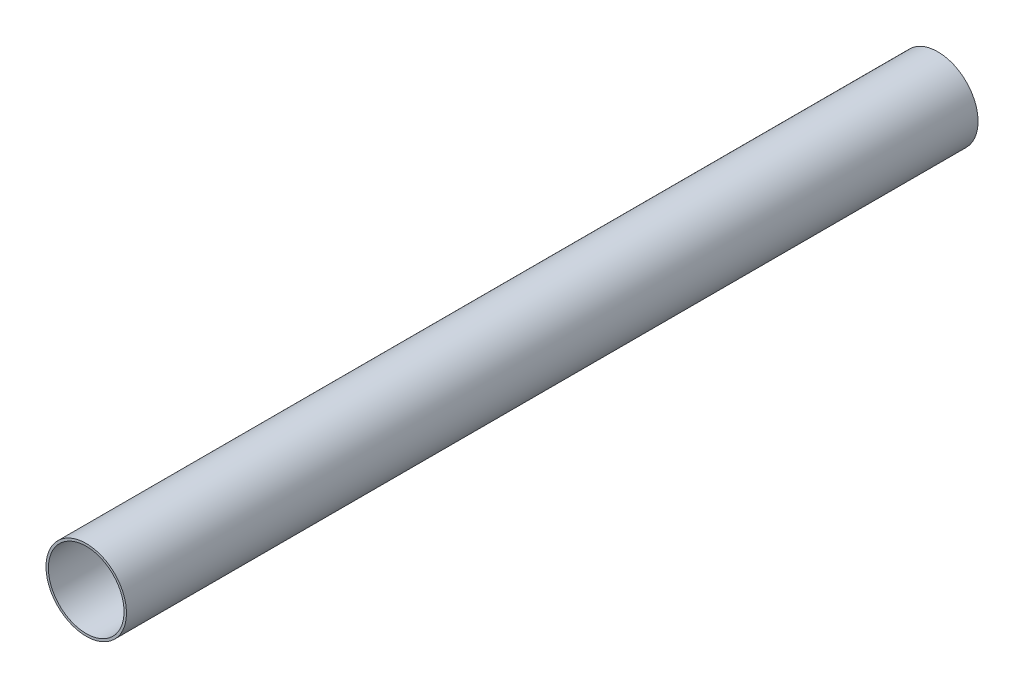
ISO-10303-21;
HEADER;
FILE_DESCRIPTION(('STEP AP214'),'2;1');
FILE_NAME('part.step','',(''),(''),'','','');
FILE_SCHEMA(('AUTOMOTIVE_DESIGN { 1 0 10303 214 1 1 1 1 }'));
ENDSEC;
DATA;
#1=APPLICATION_CONTEXT('core data for automotive mechanical design processes');
#2=APPLICATION_PROTOCOL_DEFINITION('international standard','automotive_design',2000,#1);
#3=PRODUCT_CONTEXT('',#1,'mechanical');
#4=PRODUCT('Part','Part','',(#3));
#5=PRODUCT_RELATED_PRODUCT_CATEGORY('part','',(#4));
#6=PRODUCT_DEFINITION_FORMATION('','',#4);
#7=PRODUCT_DEFINITION_CONTEXT('part definition',#1,'design');
#8=PRODUCT_DEFINITION('design','',#6,#7);
#9=PRODUCT_DEFINITION_SHAPE('','',#8);
#10=(LENGTH_UNIT() NAMED_UNIT(*) SI_UNIT(.MILLI.,.METRE.));
#11=(NAMED_UNIT(*) PLANE_ANGLE_UNIT() SI_UNIT($,.RADIAN.));
#12=(NAMED_UNIT(*) SI_UNIT($,.STERADIAN.) SOLID_ANGLE_UNIT());
#13=UNCERTAINTY_MEASURE_WITH_UNIT(LENGTH_MEASURE(1.E-05),#10,'distance_accuracy_value','');
#14=(GEOMETRIC_REPRESENTATION_CONTEXT(3) GLOBAL_UNCERTAINTY_ASSIGNED_CONTEXT((#13)) GLOBAL_UNIT_ASSIGNED_CONTEXT((#10,
#11,#12)) REPRESENTATION_CONTEXT('',''));
#15=CARTESIAN_POINT('',(0.,0.,0.));
#16=DIRECTION('',(0.,0.,1.));
#17=DIRECTION('',(1.,0.,0.));
#18=AXIS2_PLACEMENT_3D('',#15,#16,#17);
#19=CARTESIAN_POINT('',(0.,0.,180.));
#20=DIRECTION('',(0.,0.,1.));
#21=DIRECTION('',(1.,0.,0.));
#22=AXIS2_PLACEMENT_3D('',#19,#20,#21);
#23=PLANE('',#22);
#24=CARTESIAN_POINT('',(0.,0.,180.));
#25=DIRECTION('',(0.,0.,1.));
#26=DIRECTION('',(1.,0.,0.));
#27=AXIS2_PLACEMENT_3D('',#24,#25,#26);
#28=CIRCLE('',#27,8.5);
#29=CARTESIAN_POINT('',(-8.5,0.,180.));
#30=VERTEX_POINT('',#29);
#31=EDGE_CURVE('E10',#30,#30,#28,.T.);
#32=ORIENTED_EDGE('',*,*,#31,.T.);
#33=EDGE_LOOP('',(#32));
#34=FACE_BOUND('',#33,.T.);
#35=CARTESIAN_POINT('',(0.,0.,180.));
#36=DIRECTION('',(0.,0.,1.));
#37=DIRECTION('',(1.,0.,0.));
#38=AXIS2_PLACEMENT_3D('',#35,#36,#37);
#39=CIRCLE('',#38,8.);
#40=CARTESIAN_POINT('',(-8.,0.,180.));
#41=VERTEX_POINT('',#40);
#42=EDGE_CURVE('E48',#41,#41,#39,.T.);
#43=ORIENTED_EDGE('',*,*,#42,.F.);
#44=EDGE_LOOP('',(#43));
#45=FACE_BOUND('',#44,.T.);
#46=ADVANCED_FACE('F40',(#34,#45),#23,.T.);
#47=CARTESIAN_POINT('',(0.,0.,0.));
#48=DIRECTION('',(0.,0.,1.));
#49=DIRECTION('',(1.,0.,0.));
#50=AXIS2_PLACEMENT_3D('',#47,#48,#49);
#51=PLANE('',#50);
#52=CARTESIAN_POINT('',(0.,0.,0.));
#53=DIRECTION('',(0.,0.,1.));
#54=DIRECTION('',(1.,0.,0.));
#55=AXIS2_PLACEMENT_3D('',#52,#53,#54);
#56=CIRCLE('',#55,8.5);
#57=CARTESIAN_POINT('',(-8.5,0.,0.));
#58=VERTEX_POINT('',#57);
#59=EDGE_CURVE('E41',#58,#58,#56,.T.);
#60=ORIENTED_EDGE('',*,*,#59,.F.);
#61=EDGE_LOOP('',(#60));
#62=FACE_BOUND('',#61,.T.);
#63=CARTESIAN_POINT('',(0.,0.,0.));
#64=DIRECTION('',(0.,0.,1.));
#65=DIRECTION('',(1.,0.,0.));
#66=AXIS2_PLACEMENT_3D('',#63,#64,#65);
#67=CIRCLE('',#66,8.);
#68=CARTESIAN_POINT('',(-8.,0.,0.));
#69=VERTEX_POINT('',#68);
#70=EDGE_CURVE('E49',#69,#69,#67,.T.);
#71=ORIENTED_EDGE('',*,*,#70,.T.);
#72=EDGE_LOOP('',(#71));
#73=FACE_BOUND('',#72,.T.);
#74=ADVANCED_FACE('F58',(#62,#73),#51,.F.);
#75=CARTESIAN_POINT('',(0.,0.,180.));
#76=DIRECTION('',(0.,0.,-1.));
#77=DIRECTION('',(-1.,0.,0.));
#78=AXIS2_PLACEMENT_3D('',#75,#76,#77);
#79=CYLINDRICAL_SURFACE('',#78,8.5);
#80=CARTESIAN_POINT('',(-8.5,0.,180.));
#81=CARTESIAN_POINT('',(-8.5,0.,178.125));
#82=CARTESIAN_POINT('',(-8.5,0.,176.25));
#83=CARTESIAN_POINT('',(-8.5,0.,172.5));
#84=CARTESIAN_POINT('',(-8.5,0.,170.625));
#85=CARTESIAN_POINT('',(-8.5,0.,166.875));
#86=CARTESIAN_POINT('',(-8.5,0.,165.));
#87=CARTESIAN_POINT('',(-8.5,0.,161.25));
#88=CARTESIAN_POINT('',(-8.5,0.,159.375));
#89=CARTESIAN_POINT('',(-8.5,0.,155.625));
#90=CARTESIAN_POINT('',(-8.5,0.,153.75));
#91=CARTESIAN_POINT('',(-8.5,0.,150.));
#92=CARTESIAN_POINT('',(-8.5,0.,148.125));
#93=CARTESIAN_POINT('',(-8.5,0.,144.375));
#94=CARTESIAN_POINT('',(-8.5,0.,142.5));
#95=CARTESIAN_POINT('',(-8.5,0.,138.75));
#96=CARTESIAN_POINT('',(-8.5,0.,136.875));
#97=CARTESIAN_POINT('',(-8.5,0.,133.125));
#98=CARTESIAN_POINT('',(-8.5,0.,131.25));
#99=CARTESIAN_POINT('',(-8.5,0.,127.5));
#100=CARTESIAN_POINT('',(-8.5,0.,125.625));
#101=CARTESIAN_POINT('',(-8.5,0.,121.875));
#102=CARTESIAN_POINT('',(-8.5,0.,120.));
#103=CARTESIAN_POINT('',(-8.5,0.,116.25));
#104=CARTESIAN_POINT('',(-8.5,0.,114.375));
#105=CARTESIAN_POINT('',(-8.5,0.,110.625));
#106=CARTESIAN_POINT('',(-8.5,0.,108.75));
#107=CARTESIAN_POINT('',(-8.5,0.,105.));
#108=CARTESIAN_POINT('',(-8.5,0.,103.125));
#109=CARTESIAN_POINT('',(-8.5,0.,99.375));
#110=CARTESIAN_POINT('',(-8.5,0.,97.5));
#111=CARTESIAN_POINT('',(-8.5,0.,93.75));
#112=CARTESIAN_POINT('',(-8.5,0.,91.875));
#113=CARTESIAN_POINT('',(-8.5,0.,88.125));
#114=CARTESIAN_POINT('',(-8.5,0.,86.25));
#115=CARTESIAN_POINT('',(-8.5,0.,82.5));
#116=CARTESIAN_POINT('',(-8.5,0.,80.625));
#117=CARTESIAN_POINT('',(-8.5,0.,76.875));
#118=CARTESIAN_POINT('',(-8.5,0.,75.));
#119=CARTESIAN_POINT('',(-8.5,0.,71.25));
#120=CARTESIAN_POINT('',(-8.5,0.,69.375));
#121=CARTESIAN_POINT('',(-8.5,0.,65.625));
#122=CARTESIAN_POINT('',(-8.5,0.,63.75));
#123=CARTESIAN_POINT('',(-8.5,0.,60.));
#124=CARTESIAN_POINT('',(-8.5,0.,58.125));
#125=CARTESIAN_POINT('',(-8.5,0.,54.375));
#126=CARTESIAN_POINT('',(-8.5,0.,52.5));
#127=CARTESIAN_POINT('',(-8.5,0.,48.75));
#128=CARTESIAN_POINT('',(-8.5,0.,46.875));
#129=CARTESIAN_POINT('',(-8.5,0.,43.125));
#130=CARTESIAN_POINT('',(-8.5,0.,41.25));
#131=CARTESIAN_POINT('',(-8.5,0.,37.5));
#132=CARTESIAN_POINT('',(-8.5,0.,35.625));
#133=CARTESIAN_POINT('',(-8.5,0.,31.875));
#134=CARTESIAN_POINT('',(-8.5,0.,30.));
#135=CARTESIAN_POINT('',(-8.5,0.,26.25));
#136=CARTESIAN_POINT('',(-8.5,0.,24.375));
#137=CARTESIAN_POINT('',(-8.5,0.,20.625));
#138=CARTESIAN_POINT('',(-8.5,0.,18.75));
#139=CARTESIAN_POINT('',(-8.5,0.,15.));
#140=CARTESIAN_POINT('',(-8.5,0.,13.125));
#141=CARTESIAN_POINT('',(-8.5,0.,9.37499999999998));
#142=CARTESIAN_POINT('',(-8.5,0.,7.49999999999997));
#143=CARTESIAN_POINT('',(-8.5,0.,3.74999999999997));
#144=CARTESIAN_POINT('',(-8.5,0.,1.87499999999997));
#145=CARTESIAN_POINT('',(-8.5,0.,0.));
#146=B_SPLINE_CURVE_WITH_KNOTS('',3,(#80,#81,#82,#83,#84,#85,#86,#87,#88,#89,#90,#91,#92,#93,
#94,#95,#96,#97,#98,#99,#100,#101,#102,#103,#104,#105,#106,#107,#108,#109,#110,#111,#112,#113,
#114,#115,#116,#117,#118,#119,#120,#121,#122,#123,#124,#125,#126,#127,#128,#129,#130,#131,#132,
#133,#134,#135,#136,#137,#138,#139,#140,#141,#142,#143,#144,#145),.UNSPECIFIED.,.F.,.F.,(4,2,2,
2,2,2,2,2,2,2,2,2,2,2,2,2,2,2,2,2,2,2,2,2,2,2,2,2,2,2,2,2,4),(0.,5.62500000000002,11.25,16.875,
22.5,28.125,33.75,39.375,45.,50.625,56.25,61.875,67.5,73.125,78.75,84.375,90.,95.625,101.25,
106.875,112.5,118.125,123.75,129.375,135.,140.625,146.25,151.875,157.5,163.125,168.75,174.375,
180.),.UNSPECIFIED.);
#147=EDGE_CURVE('BSEAM39',#30,#58,#146,.T.);
#148=ORIENTED_EDGE('',*,*,#31,.F.);
#149=ORIENTED_EDGE('',*,*,#59,.T.);
#150=ORIENTED_EDGE('',*,*,#147,.T.);
#151=ORIENTED_EDGE('',*,*,#147,.F.);
#152=EDGE_LOOP('',(#148,#150,#149,#151));
#153=FACE_BOUND('',#152,.T.);
#154=ADVANCED_FACE('F39',(#153),#79,.T.);
#155=CARTESIAN_POINT('',(0.,0.,180.));
#156=DIRECTION('',(0.,0.,-1.));
#157=DIRECTION('',(-1.,0.,0.));
#158=AXIS2_PLACEMENT_3D('',#155,#156,#157);
#159=CYLINDRICAL_SURFACE('',#158,8.);
#160=CARTESIAN_POINT('',(-8.,0.,180.));
#161=CARTESIAN_POINT('',(-8.,0.,178.125));
#162=CARTESIAN_POINT('',(-8.,0.,176.25));
#163=CARTESIAN_POINT('',(-8.,0.,172.5));
#164=CARTESIAN_POINT('',(-8.,0.,170.625));
#165=CARTESIAN_POINT('',(-8.,0.,166.875));
#166=CARTESIAN_POINT('',(-8.,0.,165.));
#167=CARTESIAN_POINT('',(-8.,0.,161.25));
#168=CARTESIAN_POINT('',(-8.,0.,159.375));
#169=CARTESIAN_POINT('',(-8.,0.,155.625));
#170=CARTESIAN_POINT('',(-8.,0.,153.75));
#171=CARTESIAN_POINT('',(-8.,0.,150.));
#172=CARTESIAN_POINT('',(-8.,0.,148.125));
#173=CARTESIAN_POINT('',(-8.,0.,144.375));
#174=CARTESIAN_POINT('',(-8.,0.,142.5));
#175=CARTESIAN_POINT('',(-8.,0.,138.75));
#176=CARTESIAN_POINT('',(-8.,0.,136.875));
#177=CARTESIAN_POINT('',(-8.,0.,133.125));
#178=CARTESIAN_POINT('',(-8.,0.,131.25));
#179=CARTESIAN_POINT('',(-8.,0.,127.5));
#180=CARTESIAN_POINT('',(-8.,0.,125.625));
#181=CARTESIAN_POINT('',(-8.,0.,121.875));
#182=CARTESIAN_POINT('',(-8.,0.,120.));
#183=CARTESIAN_POINT('',(-8.,0.,116.25));
#184=CARTESIAN_POINT('',(-8.,0.,114.375));
#185=CARTESIAN_POINT('',(-8.,0.,110.625));
#186=CARTESIAN_POINT('',(-8.,0.,108.75));
#187=CARTESIAN_POINT('',(-8.,0.,105.));
#188=CARTESIAN_POINT('',(-8.,0.,103.125));
#189=CARTESIAN_POINT('',(-8.,0.,99.375));
#190=CARTESIAN_POINT('',(-8.,0.,97.5));
#191=CARTESIAN_POINT('',(-8.,0.,93.75));
#192=CARTESIAN_POINT('',(-8.,0.,91.875));
#193=CARTESIAN_POINT('',(-8.,0.,88.125));
#194=CARTESIAN_POINT('',(-8.,0.,86.25));
#195=CARTESIAN_POINT('',(-8.,0.,82.5));
#196=CARTESIAN_POINT('',(-8.,0.,80.625));
#197=CARTESIAN_POINT('',(-8.,0.,76.875));
#198=CARTESIAN_POINT('',(-8.,0.,75.));
#199=CARTESIAN_POINT('',(-8.,0.,71.25));
#200=CARTESIAN_POINT('',(-8.,0.,69.375));
#201=CARTESIAN_POINT('',(-8.,0.,65.625));
#202=CARTESIAN_POINT('',(-8.,0.,63.75));
#203=CARTESIAN_POINT('',(-8.,0.,60.));
#204=CARTESIAN_POINT('',(-8.,0.,58.125));
#205=CARTESIAN_POINT('',(-8.,0.,54.375));
#206=CARTESIAN_POINT('',(-8.,0.,52.5));
#207=CARTESIAN_POINT('',(-8.,0.,48.75));
#208=CARTESIAN_POINT('',(-8.,0.,46.875));
#209=CARTESIAN_POINT('',(-8.,0.,43.125));
#210=CARTESIAN_POINT('',(-8.,0.,41.25));
#211=CARTESIAN_POINT('',(-8.,0.,37.5));
#212=CARTESIAN_POINT('',(-8.,0.,35.625));
#213=CARTESIAN_POINT('',(-8.,0.,31.875));
#214=CARTESIAN_POINT('',(-8.,0.,30.));
#215=CARTESIAN_POINT('',(-8.,0.,26.25));
#216=CARTESIAN_POINT('',(-8.,0.,24.375));
#217=CARTESIAN_POINT('',(-8.,0.,20.625));
#218=CARTESIAN_POINT('',(-8.,0.,18.75));
#219=CARTESIAN_POINT('',(-8.,0.,15.));
#220=CARTESIAN_POINT('',(-8.,0.,13.125));
#221=CARTESIAN_POINT('',(-8.,0.,9.37499999999998));
#222=CARTESIAN_POINT('',(-8.,0.,7.49999999999997));
#223=CARTESIAN_POINT('',(-8.,0.,3.74999999999997));
#224=CARTESIAN_POINT('',(-8.,0.,1.87499999999997));
#225=CARTESIAN_POINT('',(-8.,0.,0.));
#226=B_SPLINE_CURVE_WITH_KNOTS('',3,(#160,#161,#162,#163,#164,#165,#166,#167,#168,#169,#170,
#171,#172,#173,#174,#175,#176,#177,#178,#179,#180,#181,#182,#183,#184,#185,#186,#187,#188,#189,
#190,#191,#192,#193,#194,#195,#196,#197,#198,#199,#200,#201,#202,#203,#204,#205,#206,#207,#208,
#209,#210,#211,#212,#213,#214,#215,#216,#217,#218,#219,#220,#221,#222,#223,#224,#225),
.UNSPECIFIED.,.F.,.F.,(4,2,2,2,2,2,2,2,2,2,2,2,2,2,2,2,2,2,2,2,2,2,2,2,2,2,2,2,2,2,2,2,4),(0.,
5.62499999999999,11.25,16.875,22.5,28.125,33.75,39.375,45.,50.625,56.25,61.875,67.5,73.125,
78.75,84.375,90.,95.625,101.25,106.875,112.5,118.125,123.75,129.375,135.,140.625,146.25,151.875,
157.5,163.125,168.75,174.375,180.),.UNSPECIFIED.);
#227=EDGE_CURVE('BSEAM57',#41,#69,#226,.T.);
#228=ORIENTED_EDGE('',*,*,#42,.T.);
#229=ORIENTED_EDGE('',*,*,#70,.F.);
#230=ORIENTED_EDGE('',*,*,#227,.T.);
#231=ORIENTED_EDGE('',*,*,#227,.F.);
#232=EDGE_LOOP('',(#228,#230,#229,#231));
#233=FACE_BOUND('',#232,.T.);
#234=ADVANCED_FACE('F57',(#233),#159,.F.);
#235=CLOSED_SHELL('',(#46,#74,#154,#234));
#236=MANIFOLD_SOLID_BREP('B2',#235);
#237=ADVANCED_BREP_SHAPE_REPRESENTATION('',(#18,#236),#14);
#238=SHAPE_DEFINITION_REPRESENTATION(#9,#237);
ENDSEC;
END-ISO-10303-21;
